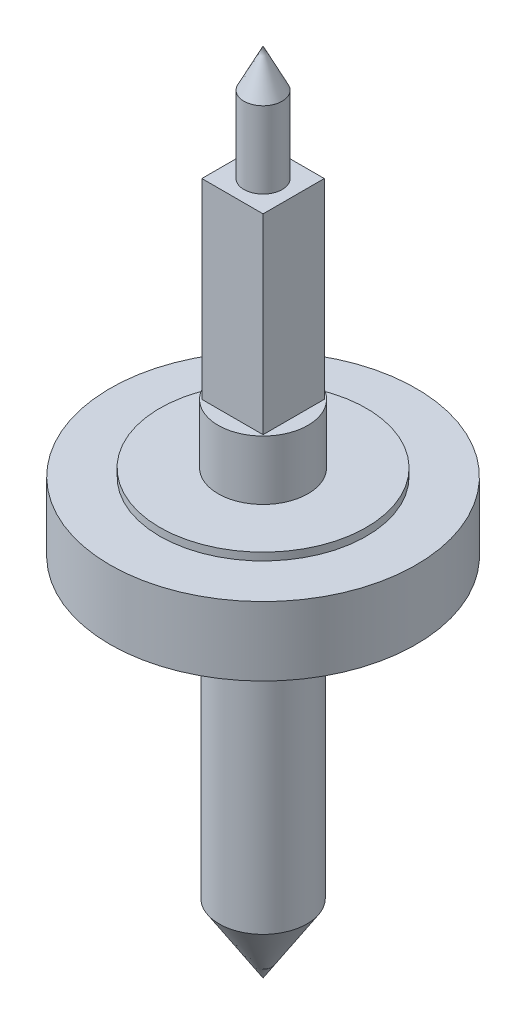
ISO-10303-21;
HEADER;
FILE_DESCRIPTION(('STEP AP214'),'2;1');
FILE_NAME('part.step','',(''),(''),'','','');
FILE_SCHEMA(('AUTOMOTIVE_DESIGN { 1 0 10303 214 1 1 1 1 }'));
ENDSEC;
DATA;
#1=APPLICATION_CONTEXT('core data for automotive mechanical design processes');
#2=APPLICATION_PROTOCOL_DEFINITION('international standard','automotive_design',2000,#1);
#3=PRODUCT_CONTEXT('',#1,'mechanical');
#4=PRODUCT('Part','Part','',(#3));
#5=PRODUCT_RELATED_PRODUCT_CATEGORY('part','',(#4));
#6=PRODUCT_DEFINITION_FORMATION('','',#4);
#7=PRODUCT_DEFINITION_CONTEXT('part definition',#1,'design');
#8=PRODUCT_DEFINITION('design','',#6,#7);
#9=PRODUCT_DEFINITION_SHAPE('','',#8);
#10=(LENGTH_UNIT() NAMED_UNIT(*) SI_UNIT(.MILLI.,.METRE.));
#11=(NAMED_UNIT(*) PLANE_ANGLE_UNIT() SI_UNIT($,.RADIAN.));
#12=(NAMED_UNIT(*) SI_UNIT($,.STERADIAN.) SOLID_ANGLE_UNIT());
#13=UNCERTAINTY_MEASURE_WITH_UNIT(LENGTH_MEASURE(1.E-05),#10,'distance_accuracy_value','');
#14=(GEOMETRIC_REPRESENTATION_CONTEXT(3) GLOBAL_UNCERTAINTY_ASSIGNED_CONTEXT((#13)) GLOBAL_UNIT_ASSIGNED_CONTEXT((#10,
#11,#12)) REPRESENTATION_CONTEXT('',''));
#15=CARTESIAN_POINT('',(0.,0.,0.));
#16=DIRECTION('',(0.,0.,1.));
#17=DIRECTION('',(1.,0.,0.));
#18=AXIS2_PLACEMENT_3D('',#15,#16,#17);
#19=CARTESIAN_POINT('',(0.,7.,0.));
#20=DIRECTION('',(0.,-1.,0.));
#21=DIRECTION('',(0.,0.,-1.));
#22=AXIS2_PLACEMENT_3D('',#19,#20,#21);
#23=CONICAL_SURFACE('',#22,0.500000000000003,0.463647609000807);
#24=CARTESIAN_POINT('',(0.,8.,0.));
#25=VERTEX_POINT('',#24);
#26=VERTEX_LOOP('',#25);
#27=FACE_BOUND('',#26,.T.);
#28=CARTESIAN_POINT('',(0.,7.,0.));
#29=DIRECTION('',(0.,1.,0.));
#30=DIRECTION('',(0.,0.,1.));
#31=AXIS2_PLACEMENT_3D('',#28,#29,#30);
#32=CIRCLE('',#31,0.500000000000003);
#33=CARTESIAN_POINT('',(0.,7.,0.500000000000003));
#34=VERTEX_POINT('',#33);
#35=EDGE_CURVE('E12',#34,#34,#32,.T.);
#36=ORIENTED_EDGE('',*,*,#35,.T.);
#37=EDGE_LOOP('',(#36));
#38=FACE_BOUND('',#37,.T.);
#39=ADVANCED_FACE('F44',(#27,#38),#23,.T.);
#40=CARTESIAN_POINT('',(0.,7.,0.));
#41=DIRECTION('',(0.,1.,0.));
#42=DIRECTION('',(0.,0.,1.));
#43=AXIS2_PLACEMENT_3D('',#40,#41,#42);
#44=PLANE('',#43);
#45=ORIENTED_EDGE('',*,*,#35,.F.);
#46=EDGE_LOOP('',(#45));
#47=FACE_BOUND('',#46,.T.);
#48=ADVANCED_FACE('F53',(#47),#44,.F.);
#49=CLOSED_SHELL('',(#39,#48));
#50=MANIFOLD_SOLID_BREP('B2',#49);
#51=CARTESIAN_POINT('',(0.,5.,0.));
#52=DIRECTION('',(0.,1.,0.));
#53=DIRECTION('',(0.,0.,1.));
#54=AXIS2_PLACEMENT_3D('',#51,#52,#53);
#55=PLANE('',#54);
#56=DIRECTION('',(0.,0.,1.));
#57=VECTOR('',#56,1.);
#58=CARTESIAN_POINT('',(-0.8,5.,-0.8));
#59=LINE('',#58,#57);
#60=CARTESIAN_POINT('',(-0.8,5.,-0.8));
#61=VERTEX_POINT('',#60);
#62=CARTESIAN_POINT('',(-0.8,5.,0.8));
#63=VERTEX_POINT('',#62);
#64=EDGE_CURVE('E123',#61,#63,#59,.T.);
#65=ORIENTED_EDGE('',*,*,#64,.T.);
#66=DIRECTION('',(1.,0.,0.));
#67=VECTOR('',#66,1.);
#68=CARTESIAN_POINT('',(-0.8,5.,0.8));
#69=LINE('',#68,#67);
#70=CARTESIAN_POINT('',(0.8,5.,0.8));
#71=VERTEX_POINT('',#70);
#72=EDGE_CURVE('E112',#63,#71,#69,.T.);
#73=ORIENTED_EDGE('',*,*,#72,.T.);
#74=DIRECTION('',(0.,0.,-1.));
#75=VECTOR('',#74,1.);
#76=CARTESIAN_POINT('',(0.8,5.,-0.8));
#77=LINE('',#76,#75);
#78=CARTESIAN_POINT('',(0.8,5.,-0.8));
#79=VERTEX_POINT('',#78);
#80=EDGE_CURVE('E122',#71,#79,#77,.T.);
#81=ORIENTED_EDGE('',*,*,#80,.T.);
#82=DIRECTION('',(-1.,0.,0.));
#83=VECTOR('',#82,1.);
#84=CARTESIAN_POINT('',(-0.8,5.,-0.8));
#85=LINE('',#84,#83);
#86=EDGE_CURVE('E128',#79,#61,#85,.T.);
#87=ORIENTED_EDGE('',*,*,#86,.T.);
#88=EDGE_LOOP('',(#65,#73,#81,#87));
#89=FACE_BOUND('',#88,.T.);
#90=CARTESIAN_POINT('',(0.,5.,0.));
#91=DIRECTION('',(0.,1.,0.));
#92=DIRECTION('',(0.,0.,1.));
#93=AXIS2_PLACEMENT_3D('',#90,#91,#92);
#94=CIRCLE('',#93,0.5);
#95=CARTESIAN_POINT('',(0.,5.,0.5));
#96=VERTEX_POINT('',#95);
#97=EDGE_CURVE('E372',#96,#96,#94,.T.);
#98=ORIENTED_EDGE('',*,*,#97,.F.);
#99=EDGE_LOOP('',(#98));
#100=FACE_BOUND('',#99,.T.);
#101=ADVANCED_FACE('F71',(#89,#100),#55,.T.);
#102=CARTESIAN_POINT('',(1.175,0.,0.));
#103=DIRECTION('',(0.,-1.,0.));
#104=DIRECTION('',(0.,0.,-1.));
#105=AXIS2_PLACEMENT_3D('',#102,#103,#104);
#106=PLANE('',#105);
#107=CARTESIAN_POINT('',(0.,0.,0.));
#108=DIRECTION('',(0.,1.,0.));
#109=DIRECTION('',(0.,0.,1.));
#110=AXIS2_PLACEMENT_3D('',#107,#108,#109);
#111=CIRCLE('',#110,1.175);
#112=CARTESIAN_POINT('',(0.,0.,1.175));
#113=VERTEX_POINT('',#112);
#114=EDGE_CURVE('E136',#113,#113,#111,.T.);
#115=ORIENTED_EDGE('',*,*,#114,.T.);
#116=EDGE_LOOP('',(#115));
#117=FACE_BOUND('',#116,.T.);
#118=DIRECTION('',(0.,0.,1.));
#119=VECTOR('',#118,1.);
#120=CARTESIAN_POINT('',(-0.8,0.,-0.8));
#121=LINE('',#120,#119);
#122=CARTESIAN_POINT('',(-0.8,0.,-0.8));
#123=VERTEX_POINT('',#122);
#124=CARTESIAN_POINT('',(-0.8,0.,0.8));
#125=VERTEX_POINT('',#124);
#126=EDGE_CURVE('E135',#123,#125,#121,.T.);
#127=ORIENTED_EDGE('',*,*,#126,.F.);
#128=DIRECTION('',(-1.,0.,0.));
#129=VECTOR('',#128,1.);
#130=CARTESIAN_POINT('',(-0.8,0.,-0.8));
#131=LINE('',#130,#129);
#132=CARTESIAN_POINT('',(0.8,0.,-0.8));
#133=VERTEX_POINT('',#132);
#134=EDGE_CURVE('E132',#133,#123,#131,.T.);
#135=ORIENTED_EDGE('',*,*,#134,.F.);
#136=DIRECTION('',(0.,0.,-1.));
#137=VECTOR('',#136,1.);
#138=CARTESIAN_POINT('',(0.8,0.,-0.8));
#139=LINE('',#138,#137);
#140=CARTESIAN_POINT('',(0.8,0.,0.8));
#141=VERTEX_POINT('',#140);
#142=EDGE_CURVE('E91',#141,#133,#139,.T.);
#143=ORIENTED_EDGE('',*,*,#142,.F.);
#144=DIRECTION('',(1.,0.,0.));
#145=VECTOR('',#144,1.);
#146=CARTESIAN_POINT('',(-0.8,0.,0.8));
#147=LINE('',#146,#145);
#148=EDGE_CURVE('E86',#125,#141,#147,.T.);
#149=ORIENTED_EDGE('',*,*,#148,.F.);
#150=EDGE_LOOP('',(#127,#135,#143,#149));
#151=FACE_BOUND('',#150,.T.);
#152=ADVANCED_FACE('F182',(#117,#151),#106,.F.);
#153=CARTESIAN_POINT('',(0.,-13.1,0.));
#154=DIRECTION('',(0.,1.,0.));
#155=DIRECTION('',(0.,0.,1.));
#156=AXIS2_PLACEMENT_3D('',#153,#154,#155);
#157=CONICAL_SURFACE('',#156,0.,0.568524547731041);
#158=CARTESIAN_POINT('',(0.,-11.3,0.));
#159=DIRECTION('',(0.,1.,0.));
#160=DIRECTION('',(0.,0.,1.));
#161=AXIS2_PLACEMENT_3D('',#158,#159,#160);
#162=CIRCLE('',#161,1.15000000000001);
#163=CARTESIAN_POINT('',(0.,-11.3,1.15000000000001));
#164=VERTEX_POINT('',#163);
#165=EDGE_CURVE('E42',#164,#164,#162,.T.);
#166=ORIENTED_EDGE('',*,*,#165,.F.);
#167=EDGE_LOOP('',(#166));
#168=FACE_BOUND('',#167,.T.);
#169=CARTESIAN_POINT('',(0.,-13.1,0.));
#170=VERTEX_POINT('',#169);
#171=VERTEX_LOOP('',#170);
#172=FACE_BOUND('',#171,.T.);
#173=ADVANCED_FACE('F73',(#168,#172),#157,.T.);
#174=CARTESIAN_POINT('',(0.,31.5561010071204,0.));
#175=DIRECTION('',(0.,1.,0.));
#176=DIRECTION('',(0.,0.,1.));
#177=AXIS2_PLACEMENT_3D('',#174,#175,#176);
#178=CYLINDRICAL_SURFACE('',#177,1.15000000000001);
#179=CARTESIAN_POINT('',(0.,-5.3,0.));
#180=DIRECTION('',(0.,1.,0.));
#181=DIRECTION('',(0.,0.,1.));
#182=AXIS2_PLACEMENT_3D('',#179,#180,#181);
#183=CIRCLE('',#182,1.15000000000001);
#184=CARTESIAN_POINT('',(0.,-5.3,1.15000000000001));
#185=VERTEX_POINT('',#184);
#186=EDGE_CURVE('E79',#185,#185,#183,.T.);
#187=ORIENTED_EDGE('',*,*,#186,.F.);
#188=EDGE_LOOP('',(#187));
#189=FACE_BOUND('',#188,.T.);
#190=ORIENTED_EDGE('',*,*,#165,.T.);
#191=EDGE_LOOP('',(#190));
#192=FACE_BOUND('',#191,.T.);
#193=ADVANCED_FACE('F175',(#189,#192),#178,.T.);
#194=CARTESIAN_POINT('',(1.15000000000001,-5.3,0.));
#195=DIRECTION('',(0.,1.,0.));
#196=DIRECTION('',(0.,0.,1.));
#197=AXIS2_PLACEMENT_3D('',#194,#195,#196);
#198=PLANE('',#197);
#199=CARTESIAN_POINT('',(0.,-5.3,0.));
#200=DIRECTION('',(0.,1.,0.));
#201=DIRECTION('',(0.,0.,1.));
#202=AXIS2_PLACEMENT_3D('',#199,#200,#201);
#203=CIRCLE('',#202,1.175);
#204=CARTESIAN_POINT('',(0.,-5.3,1.175));
#205=VERTEX_POINT('',#204);
#206=EDGE_CURVE('E168',#205,#205,#203,.T.);
#207=ORIENTED_EDGE('',*,*,#206,.F.);
#208=EDGE_LOOP('',(#207));
#209=FACE_BOUND('',#208,.T.);
#210=ORIENTED_EDGE('',*,*,#186,.T.);
#211=EDGE_LOOP('',(#210));
#212=FACE_BOUND('',#211,.T.);
#213=ADVANCED_FACE('F173',(#209,#212),#198,.F.);
#214=CARTESIAN_POINT('',(0.,31.5561010071204,0.));
#215=DIRECTION('',(0.,1.,0.));
#216=DIRECTION('',(0.,0.,1.));
#217=AXIS2_PLACEMENT_3D('',#214,#215,#216);
#218=CYLINDRICAL_SURFACE('',#217,1.175);
#219=CARTESIAN_POINT('',(0.,-3.75,0.));
#220=DIRECTION('',(0.,1.,0.));
#221=DIRECTION('',(0.,0.,1.));
#222=AXIS2_PLACEMENT_3D('',#219,#220,#221);
#223=CIRCLE('',#222,1.175);
#224=CARTESIAN_POINT('',(0.,-3.75,1.175));
#225=VERTEX_POINT('',#224);
#226=EDGE_CURVE('E165',#225,#225,#223,.T.);
#227=ORIENTED_EDGE('',*,*,#226,.F.);
#228=EDGE_LOOP('',(#227));
#229=FACE_BOUND('',#228,.T.);
#230=ORIENTED_EDGE('',*,*,#206,.T.);
#231=EDGE_LOOP('',(#230));
#232=FACE_BOUND('',#231,.T.);
#233=ADVANCED_FACE('F239',(#229,#232),#218,.T.);
#234=CARTESIAN_POINT('',(1.175,-3.75,0.));
#235=DIRECTION('',(0.,1.,0.));
#236=DIRECTION('',(0.,0.,1.));
#237=AXIS2_PLACEMENT_3D('',#234,#235,#236);
#238=PLANE('',#237);
#239=CARTESIAN_POINT('',(0.,-3.75,0.));
#240=DIRECTION('',(0.,1.,0.));
#241=DIRECTION('',(0.,0.,1.));
#242=AXIS2_PLACEMENT_3D('',#239,#240,#241);
#243=CIRCLE('',#242,2.7);
#244=CARTESIAN_POINT('',(0.,-3.75,2.7));
#245=VERTEX_POINT('',#244);
#246=EDGE_CURVE('E162',#245,#245,#243,.T.);
#247=ORIENTED_EDGE('',*,*,#246,.F.);
#248=EDGE_LOOP('',(#247));
#249=FACE_BOUND('',#248,.T.);
#250=ORIENTED_EDGE('',*,*,#226,.T.);
#251=EDGE_LOOP('',(#250));
#252=FACE_BOUND('',#251,.T.);
#253=ADVANCED_FACE('F235',(#249,#252),#238,.F.);
#254=CARTESIAN_POINT('',(0.,31.5561010071204,0.));
#255=DIRECTION('',(0.,1.,0.));
#256=DIRECTION('',(0.,0.,1.));
#257=AXIS2_PLACEMENT_3D('',#254,#255,#256);
#258=CYLINDRICAL_SURFACE('',#257,2.7);
#259=CARTESIAN_POINT('',(0.,-3.55,0.));
#260=DIRECTION('',(0.,1.,0.));
#261=DIRECTION('',(0.,0.,1.));
#262=AXIS2_PLACEMENT_3D('',#259,#260,#261);
#263=CIRCLE('',#262,2.7);
#264=CARTESIAN_POINT('',(0.,-3.55,2.7));
#265=VERTEX_POINT('',#264);
#266=EDGE_CURVE('E159',#265,#265,#263,.T.);
#267=ORIENTED_EDGE('',*,*,#266,.F.);
#268=EDGE_LOOP('',(#267));
#269=FACE_BOUND('',#268,.T.);
#270=ORIENTED_EDGE('',*,*,#246,.T.);
#271=EDGE_LOOP('',(#270));
#272=FACE_BOUND('',#271,.T.);
#273=ADVANCED_FACE('F231',(#269,#272),#258,.T.);
#274=CARTESIAN_POINT('',(2.7,-3.55,0.));
#275=DIRECTION('',(0.,1.,0.));
#276=DIRECTION('',(0.,0.,1.));
#277=AXIS2_PLACEMENT_3D('',#274,#275,#276);
#278=PLANE('',#277);
#279=CARTESIAN_POINT('',(0.,-3.55,0.));
#280=DIRECTION('',(0.,1.,0.));
#281=DIRECTION('',(0.,0.,1.));
#282=AXIS2_PLACEMENT_3D('',#279,#280,#281);
#283=CIRCLE('',#282,4.00000000000001);
#284=CARTESIAN_POINT('',(0.,-3.55,4.00000000000001));
#285=VERTEX_POINT('',#284);
#286=EDGE_CURVE('E156',#285,#285,#283,.T.);
#287=ORIENTED_EDGE('',*,*,#286,.F.);
#288=EDGE_LOOP('',(#287));
#289=FACE_BOUND('',#288,.T.);
#290=ORIENTED_EDGE('',*,*,#266,.T.);
#291=EDGE_LOOP('',(#290));
#292=FACE_BOUND('',#291,.T.);
#293=ADVANCED_FACE('F227',(#289,#292),#278,.F.);
#294=CARTESIAN_POINT('',(0.,31.5561010071204,0.));
#295=DIRECTION('',(0.,1.,0.));
#296=DIRECTION('',(0.,0.,1.));
#297=AXIS2_PLACEMENT_3D('',#294,#295,#296);
#298=CYLINDRICAL_SURFACE('',#297,4.00000000000001);
#299=CARTESIAN_POINT('',(0.,-1.75,0.));
#300=DIRECTION('',(0.,1.,0.));
#301=DIRECTION('',(0.,0.,1.));
#302=AXIS2_PLACEMENT_3D('',#299,#300,#301);
#303=CIRCLE('',#302,4.);
#304=CARTESIAN_POINT('',(0.,-1.75,4.));
#305=VERTEX_POINT('',#304);
#306=EDGE_CURVE('E153',#305,#305,#303,.T.);
#307=ORIENTED_EDGE('',*,*,#306,.F.);
#308=EDGE_LOOP('',(#307));
#309=FACE_BOUND('',#308,.T.);
#310=ORIENTED_EDGE('',*,*,#286,.T.);
#311=EDGE_LOOP('',(#310));
#312=FACE_BOUND('',#311,.T.);
#313=ADVANCED_FACE('F223',(#309,#312),#298,.T.);
#314=CARTESIAN_POINT('',(4.,-1.75,0.));
#315=DIRECTION('',(0.,-1.,0.));
#316=DIRECTION('',(0.,0.,-1.));
#317=AXIS2_PLACEMENT_3D('',#314,#315,#316);
#318=PLANE('',#317);
#319=CARTESIAN_POINT('',(0.,-1.75,0.));
#320=DIRECTION('',(0.,1.,0.));
#321=DIRECTION('',(0.,0.,1.));
#322=AXIS2_PLACEMENT_3D('',#319,#320,#321);
#323=CIRCLE('',#322,2.7);
#324=CARTESIAN_POINT('',(0.,-1.75,2.7));
#325=VERTEX_POINT('',#324);
#326=EDGE_CURVE('E150',#325,#325,#323,.T.);
#327=ORIENTED_EDGE('',*,*,#326,.F.);
#328=EDGE_LOOP('',(#327));
#329=FACE_BOUND('',#328,.T.);
#330=ORIENTED_EDGE('',*,*,#306,.T.);
#331=EDGE_LOOP('',(#330));
#332=FACE_BOUND('',#331,.T.);
#333=ADVANCED_FACE('F219',(#329,#332),#318,.F.);
#334=CARTESIAN_POINT('',(0.,31.5561010071204,0.));
#335=DIRECTION('',(0.,1.,0.));
#336=DIRECTION('',(0.,0.,1.));
#337=AXIS2_PLACEMENT_3D('',#334,#335,#336);
#338=CYLINDRICAL_SURFACE('',#337,2.7);
#339=CARTESIAN_POINT('',(0.,-1.55,0.));
#340=DIRECTION('',(0.,1.,0.));
#341=DIRECTION('',(0.,0.,1.));
#342=AXIS2_PLACEMENT_3D('',#339,#340,#341);
#343=CIRCLE('',#342,2.7);
#344=CARTESIAN_POINT('',(0.,-1.55,2.7));
#345=VERTEX_POINT('',#344);
#346=EDGE_CURVE('E147',#345,#345,#343,.T.);
#347=ORIENTED_EDGE('',*,*,#346,.F.);
#348=EDGE_LOOP('',(#347));
#349=FACE_BOUND('',#348,.T.);
#350=ORIENTED_EDGE('',*,*,#326,.T.);
#351=EDGE_LOOP('',(#350));
#352=FACE_BOUND('',#351,.T.);
#353=ADVANCED_FACE('F215',(#349,#352),#338,.T.);
#354=CARTESIAN_POINT('',(2.7,-1.55,0.));
#355=DIRECTION('',(0.,-1.,0.));
#356=DIRECTION('',(0.,0.,-1.));
#357=AXIS2_PLACEMENT_3D('',#354,#355,#356);
#358=PLANE('',#357);
#359=CARTESIAN_POINT('',(0.,-1.55,0.));
#360=DIRECTION('',(0.,1.,0.));
#361=DIRECTION('',(0.,0.,1.));
#362=AXIS2_PLACEMENT_3D('',#359,#360,#361);
#363=CIRCLE('',#362,1.175);
#364=CARTESIAN_POINT('',(0.,-1.55,1.175));
#365=VERTEX_POINT('',#364);
#366=EDGE_CURVE('E139',#365,#365,#363,.T.);
#367=ORIENTED_EDGE('',*,*,#366,.F.);
#368=EDGE_LOOP('',(#367));
#369=FACE_BOUND('',#368,.T.);
#370=ORIENTED_EDGE('',*,*,#346,.T.);
#371=EDGE_LOOP('',(#370));
#372=FACE_BOUND('',#371,.T.);
#373=ADVANCED_FACE('F211',(#369,#372),#358,.F.);
#374=CARTESIAN_POINT('',(0.,31.5561010071204,0.));
#375=DIRECTION('',(0.,1.,0.));
#376=DIRECTION('',(0.,0.,1.));
#377=AXIS2_PLACEMENT_3D('',#374,#375,#376);
#378=CYLINDRICAL_SURFACE('',#377,1.175);
#379=ORIENTED_EDGE('',*,*,#114,.F.);
#380=EDGE_LOOP('',(#379));
#381=FACE_BOUND('',#380,.T.);
#382=ORIENTED_EDGE('',*,*,#366,.T.);
#383=EDGE_LOOP('',(#382));
#384=FACE_BOUND('',#383,.T.);
#385=ADVANCED_FACE('F207',(#381,#384),#378,.T.);
#386=CARTESIAN_POINT('',(-0.8,5.,-0.8));
#387=DIRECTION('',(1.,0.,0.));
#388=DIRECTION('',(0.,0.,-1.));
#389=AXIS2_PLACEMENT_3D('',#386,#387,#388);
#390=PLANE('',#389);
#391=ORIENTED_EDGE('',*,*,#126,.T.);
#392=DIRECTION('',(0.,-1.,0.));
#393=VECTOR('',#392,1.);
#394=CARTESIAN_POINT('',(-0.8,5.,0.8));
#395=LINE('',#394,#393);
#396=EDGE_CURVE('E116',#63,#125,#395,.T.);
#397=ORIENTED_EDGE('',*,*,#396,.F.);
#398=ORIENTED_EDGE('',*,*,#64,.F.);
#399=DIRECTION('',(0.,-1.,0.));
#400=VECTOR('',#399,1.);
#401=CARTESIAN_POINT('',(-0.8,5.,-0.8));
#402=LINE('',#401,#400);
#403=EDGE_CURVE('E379',#61,#123,#402,.T.);
#404=ORIENTED_EDGE('',*,*,#403,.T.);
#405=EDGE_LOOP('',(#391,#397,#398,#404));
#406=FACE_BOUND('',#405,.T.);
#407=ADVANCED_FACE('F134',(#406),#390,.F.);
#408=CARTESIAN_POINT('',(-0.8,5.,0.8));
#409=DIRECTION('',(0.,0.,-1.));
#410=DIRECTION('',(-1.,0.,0.));
#411=AXIS2_PLACEMENT_3D('',#408,#409,#410);
#412=PLANE('',#411);
#413=ORIENTED_EDGE('',*,*,#148,.T.);
#414=DIRECTION('',(0.,-1.,0.));
#415=VECTOR('',#414,1.);
#416=CARTESIAN_POINT('',(0.8,5.,0.8));
#417=LINE('',#416,#415);
#418=EDGE_CURVE('E119',#71,#141,#417,.T.);
#419=ORIENTED_EDGE('',*,*,#418,.F.);
#420=ORIENTED_EDGE('',*,*,#72,.F.);
#421=ORIENTED_EDGE('',*,*,#396,.T.);
#422=EDGE_LOOP('',(#413,#419,#420,#421));
#423=FACE_BOUND('',#422,.T.);
#424=ADVANCED_FACE('F114',(#423),#412,.F.);
#425=CARTESIAN_POINT('',(0.8,5.,-0.8));
#426=DIRECTION('',(-1.,0.,0.));
#427=DIRECTION('',(0.,0.,1.));
#428=AXIS2_PLACEMENT_3D('',#425,#426,#427);
#429=PLANE('',#428);
#430=ORIENTED_EDGE('',*,*,#142,.T.);
#431=DIRECTION('',(0.,-1.,0.));
#432=VECTOR('',#431,1.);
#433=CARTESIAN_POINT('',(0.8,5.,-0.8));
#434=LINE('',#433,#432);
#435=EDGE_CURVE('E141',#79,#133,#434,.T.);
#436=ORIENTED_EDGE('',*,*,#435,.F.);
#437=ORIENTED_EDGE('',*,*,#80,.F.);
#438=ORIENTED_EDGE('',*,*,#418,.T.);
#439=EDGE_LOOP('',(#430,#436,#437,#438));
#440=FACE_BOUND('',#439,.T.);
#441=ADVANCED_FACE('F199',(#440),#429,.F.);
#442=CARTESIAN_POINT('',(-0.8,5.,-0.8));
#443=DIRECTION('',(0.,0.,1.));
#444=DIRECTION('',(1.,0.,0.));
#445=AXIS2_PLACEMENT_3D('',#442,#443,#444);
#446=PLANE('',#445);
#447=ORIENTED_EDGE('',*,*,#134,.T.);
#448=ORIENTED_EDGE('',*,*,#403,.F.);
#449=ORIENTED_EDGE('',*,*,#86,.F.);
#450=ORIENTED_EDGE('',*,*,#435,.T.);
#451=EDGE_LOOP('',(#447,#448,#449,#450));
#452=FACE_BOUND('',#451,.T.);
#453=ADVANCED_FACE('F196',(#452),#446,.F.);
#454=CARTESIAN_POINT('',(0.,7.,0.));
#455=DIRECTION('',(0.,-1.,0.));
#456=DIRECTION('',(0.,0.,-1.));
#457=AXIS2_PLACEMENT_3D('',#454,#455,#456);
#458=CYLINDRICAL_SURFACE('',#457,0.5);
#459=CARTESIAN_POINT('',(0.,7.,0.));
#460=DIRECTION('',(0.,1.,0.));
#461=DIRECTION('',(0.,0.,1.));
#462=AXIS2_PLACEMENT_3D('',#459,#460,#461);
#463=CIRCLE('',#462,0.5);
#464=CARTESIAN_POINT('',(0.,7.,0.5));
#465=VERTEX_POINT('',#464);
#466=EDGE_CURVE('E371',#465,#465,#463,.T.);
#467=ORIENTED_EDGE('',*,*,#466,.F.);
#468=EDGE_LOOP('',(#467));
#469=FACE_BOUND('',#468,.T.);
#470=ORIENTED_EDGE('',*,*,#97,.T.);
#471=EDGE_LOOP('',(#470));
#472=FACE_BOUND('',#471,.T.);
#473=ADVANCED_FACE('F194',(#469,#472),#458,.T.);
#474=CARTESIAN_POINT('',(0.,7.,0.));
#475=DIRECTION('',(0.,1.,0.));
#476=DIRECTION('',(0.,0.,1.));
#477=AXIS2_PLACEMENT_3D('',#474,#475,#476);
#478=PLANE('',#477);
#479=ORIENTED_EDGE('',*,*,#466,.T.);
#480=EDGE_LOOP('',(#479));
#481=FACE_BOUND('',#480,.T.);
#482=ADVANCED_FACE('F311',(#481),#478,.T.);
#483=CLOSED_SHELL('',(#101,#152,#173,#193,#213,#233,#253,#273,#293,#313,#333,#353,#373,#385,
#407,#424,#441,#453,#473,#482));
#484=MANIFOLD_SOLID_BREP('B6',#483);
#485=ADVANCED_BREP_SHAPE_REPRESENTATION('',(#18,#50,#484),#14);
#486=SHAPE_DEFINITION_REPRESENTATION(#9,#485);
ENDSEC;
END-ISO-10303-21;
